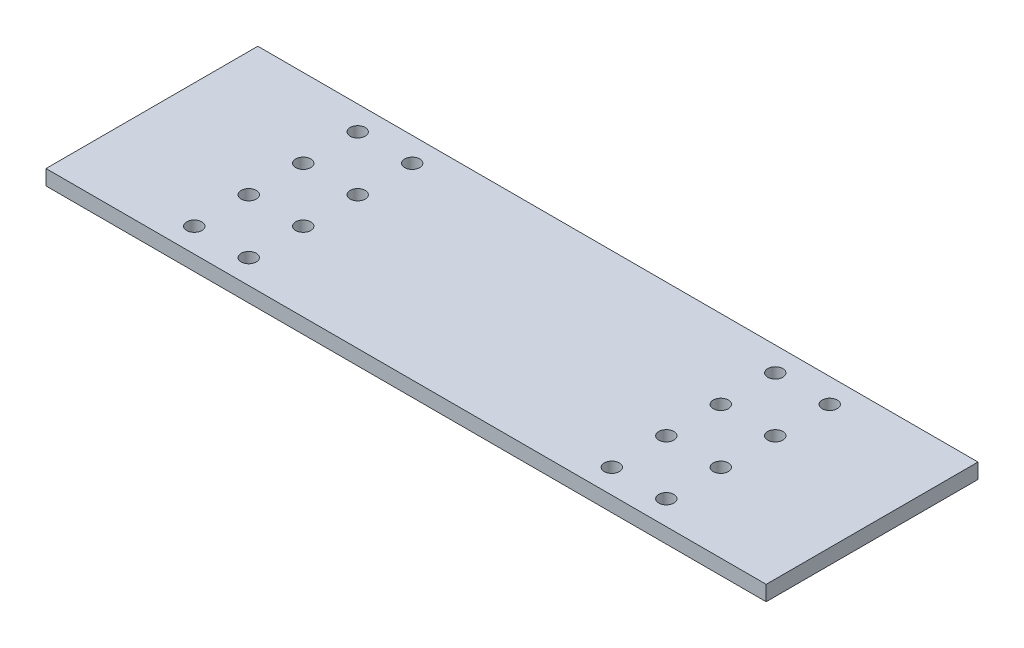
ISO-10303-21;
HEADER;
FILE_DESCRIPTION(('STEP AP214'),'2;1');
FILE_NAME('part.step','',(''),(''),'','','');
FILE_SCHEMA(('AUTOMOTIVE_DESIGN { 1 0 10303 214 1 1 1 1 }'));
ENDSEC;
DATA;
#1=APPLICATION_CONTEXT('core data for automotive mechanical design processes');
#2=APPLICATION_PROTOCOL_DEFINITION('international standard','automotive_design',2000,#1);
#3=PRODUCT_CONTEXT('',#1,'mechanical');
#4=PRODUCT('Part','Part','',(#3));
#5=PRODUCT_RELATED_PRODUCT_CATEGORY('part','',(#4));
#6=PRODUCT_DEFINITION_FORMATION('','',#4);
#7=PRODUCT_DEFINITION_CONTEXT('part definition',#1,'design');
#8=PRODUCT_DEFINITION('design','',#6,#7);
#9=PRODUCT_DEFINITION_SHAPE('','',#8);
#10=(LENGTH_UNIT() NAMED_UNIT(*) SI_UNIT(.MILLI.,.METRE.));
#11=(NAMED_UNIT(*) PLANE_ANGLE_UNIT() SI_UNIT($,.RADIAN.));
#12=(NAMED_UNIT(*) SI_UNIT($,.STERADIAN.) SOLID_ANGLE_UNIT());
#13=UNCERTAINTY_MEASURE_WITH_UNIT(LENGTH_MEASURE(1.E-05),#10,'distance_accuracy_value','');
#14=(GEOMETRIC_REPRESENTATION_CONTEXT(3) GLOBAL_UNCERTAINTY_ASSIGNED_CONTEXT((#13)) GLOBAL_UNIT_ASSIGNED_CONTEXT((#10,
#11,#12)) REPRESENTATION_CONTEXT('',''));
#15=CARTESIAN_POINT('',(0.,0.,0.));
#16=DIRECTION('',(0.,0.,1.));
#17=DIRECTION('',(1.,0.,0.));
#18=AXIS2_PLACEMENT_3D('',#15,#16,#17);
#19=CARTESIAN_POINT('',(0.,5.,0.));
#20=DIRECTION('',(0.,-1.,0.));
#21=DIRECTION('',(0.,0.,-1.));
#22=AXIS2_PLACEMENT_3D('',#19,#20,#21);
#23=PLANE('',#22);
#24=CARTESIAN_POINT('',(41.,5.,-8.00000000000001));
#25=DIRECTION('',(0.,1.,0.));
#26=DIRECTION('',(0.,0.,1.));
#27=AXIS2_PLACEMENT_3D('',#24,#25,#26);
#28=CIRCLE('',#27,2.5);
#29=CARTESIAN_POINT('',(41.,5.,-5.50000000000001));
#30=VERTEX_POINT('',#29);
#31=EDGE_CURVE('E193',#30,#30,#28,.T.);
#32=ORIENTED_EDGE('',*,*,#31,.F.);
#33=EDGE_LOOP('',(#32));
#34=FACE_BOUND('',#33,.T.);
#35=CARTESIAN_POINT('',(41.,5.,-26.));
#36=DIRECTION('',(0.,1.,0.));
#37=DIRECTION('',(0.,0.,1.));
#38=AXIS2_PLACEMENT_3D('',#35,#36,#37);
#39=CIRCLE('',#38,2.49999999999999);
#40=CARTESIAN_POINT('',(41.,5.,-23.5));
#41=VERTEX_POINT('',#40);
#42=EDGE_CURVE('E181',#41,#41,#39,.T.);
#43=ORIENTED_EDGE('',*,*,#42,.F.);
#44=EDGE_LOOP('',(#43));
#45=FACE_BOUND('',#44,.T.);
#46=CARTESIAN_POINT('',(179.,5.,-8.00000000000001));
#47=DIRECTION('',(0.,1.,0.));
#48=DIRECTION('',(0.,0.,1.));
#49=AXIS2_PLACEMENT_3D('',#46,#47,#48);
#50=CIRCLE('',#49,2.5);
#51=CARTESIAN_POINT('',(179.,5.,-5.50000000000002));
#52=VERTEX_POINT('',#51);
#53=EDGE_CURVE('E169',#52,#52,#50,.T.);
#54=ORIENTED_EDGE('',*,*,#53,.F.);
#55=EDGE_LOOP('',(#54));
#56=FACE_BOUND('',#55,.T.);
#57=CARTESIAN_POINT('',(179.,5.,-26.));
#58=DIRECTION('',(0.,1.,0.));
#59=DIRECTION('',(0.,0.,1.));
#60=AXIS2_PLACEMENT_3D('',#57,#58,#59);
#61=CIRCLE('',#60,2.5);
#62=CARTESIAN_POINT('',(179.,5.,-23.5));
#63=VERTEX_POINT('',#62);
#64=EDGE_CURVE('E157',#63,#63,#61,.T.);
#65=ORIENTED_EDGE('',*,*,#64,.F.);
#66=EDGE_LOOP('',(#65));
#67=FACE_BOUND('',#66,.T.);
#68=CARTESIAN_POINT('',(179.,5.,-44.));
#69=DIRECTION('',(0.,1.,0.));
#70=DIRECTION('',(0.,0.,1.));
#71=AXIS2_PLACEMENT_3D('',#68,#69,#70);
#72=CIRCLE('',#71,2.5);
#73=CARTESIAN_POINT('',(179.,5.,-41.5));
#74=VERTEX_POINT('',#73);
#75=EDGE_CURVE('E145',#74,#74,#72,.T.);
#76=ORIENTED_EDGE('',*,*,#75,.F.);
#77=EDGE_LOOP('',(#76));
#78=FACE_BOUND('',#77,.T.);
#79=CARTESIAN_POINT('',(179.,5.,-62.));
#80=DIRECTION('',(0.,1.,0.));
#81=DIRECTION('',(0.,0.,1.));
#82=AXIS2_PLACEMENT_3D('',#79,#80,#81);
#83=CIRCLE('',#82,2.5);
#84=CARTESIAN_POINT('',(179.,5.,-59.5));
#85=VERTEX_POINT('',#84);
#86=EDGE_CURVE('E133',#85,#85,#83,.T.);
#87=ORIENTED_EDGE('',*,*,#86,.F.);
#88=EDGE_LOOP('',(#87));
#89=FACE_BOUND('',#88,.T.);
#90=CARTESIAN_POINT('',(41.,5.,-44.));
#91=DIRECTION('',(0.,1.,0.));
#92=DIRECTION('',(0.,0.,1.));
#93=AXIS2_PLACEMENT_3D('',#90,#91,#92);
#94=CIRCLE('',#93,2.5);
#95=CARTESIAN_POINT('',(41.,5.,-41.5));
#96=VERTEX_POINT('',#95);
#97=EDGE_CURVE('E121',#96,#96,#94,.T.);
#98=ORIENTED_EDGE('',*,*,#97,.F.);
#99=EDGE_LOOP('',(#98));
#100=FACE_BOUND('',#99,.T.);
#101=CARTESIAN_POINT('',(41.,5.,-62.));
#102=DIRECTION('',(0.,1.,0.));
#103=DIRECTION('',(0.,0.,1.));
#104=AXIS2_PLACEMENT_3D('',#101,#102,#103);
#105=CIRCLE('',#104,2.49999999999999);
#106=CARTESIAN_POINT('',(41.,5.,-59.5));
#107=VERTEX_POINT('',#106);
#108=EDGE_CURVE('E100',#107,#107,#105,.T.);
#109=ORIENTED_EDGE('',*,*,#108,.F.);
#110=EDGE_LOOP('',(#109));
#111=FACE_BOUND('',#110,.T.);
#112=DIRECTION('',(0.,0.,1.));
#113=VECTOR('',#112,1.);
#114=CARTESIAN_POINT('',(0.,5.,0.));
#115=LINE('',#114,#113);
#116=CARTESIAN_POINT('',(0.,5.,-70.));
#117=VERTEX_POINT('',#116);
#118=CARTESIAN_POINT('',(0.,5.,0.));
#119=VERTEX_POINT('',#118);
#120=EDGE_CURVE('E85',#117,#119,#115,.T.);
#121=ORIENTED_EDGE('',*,*,#120,.T.);
#122=DIRECTION('',(1.,0.,0.));
#123=VECTOR('',#122,1.);
#124=CARTESIAN_POINT('',(0.,5.,0.));
#125=LINE('',#124,#123);
#126=CARTESIAN_POINT('',(238.,5.,0.));
#127=VERTEX_POINT('',#126);
#128=EDGE_CURVE('E80',#119,#127,#125,.T.);
#129=ORIENTED_EDGE('',*,*,#128,.T.);
#130=DIRECTION('',(0.,0.,-1.));
#131=VECTOR('',#130,1.);
#132=CARTESIAN_POINT('',(238.,5.,0.));
#133=LINE('',#132,#131);
#134=CARTESIAN_POINT('',(238.,5.,-70.));
#135=VERTEX_POINT('',#134);
#136=EDGE_CURVE('E83',#127,#135,#133,.T.);
#137=ORIENTED_EDGE('',*,*,#136,.T.);
#138=DIRECTION('',(-1.,0.,0.));
#139=VECTOR('',#138,1.);
#140=CARTESIAN_POINT('',(0.,5.,-70.));
#141=LINE('',#140,#139);
#142=EDGE_CURVE('E50',#135,#117,#141,.T.);
#143=ORIENTED_EDGE('',*,*,#142,.T.);
#144=EDGE_LOOP('',(#121,#129,#137,#143));
#145=FACE_BOUND('',#144,.T.);
#146=CARTESIAN_POINT('',(59.,5.,-62.0000000000003));
#147=DIRECTION('',(0.,1.,0.));
#148=DIRECTION('',(0.,0.,1.));
#149=AXIS2_PLACEMENT_3D('',#146,#147,#148);
#150=CIRCLE('',#149,2.5);
#151=CARTESIAN_POINT('',(59.,5.,-59.5000000000003));
#152=VERTEX_POINT('',#151);
#153=EDGE_CURVE('E115',#152,#152,#150,.T.);
#154=ORIENTED_EDGE('',*,*,#153,.F.);
#155=EDGE_LOOP('',(#154));
#156=FACE_BOUND('',#155,.T.);
#157=CARTESIAN_POINT('',(59.,5.,-44.));
#158=DIRECTION('',(0.,1.,0.));
#159=DIRECTION('',(0.,0.,1.));
#160=AXIS2_PLACEMENT_3D('',#157,#158,#159);
#161=CIRCLE('',#160,2.5);
#162=CARTESIAN_POINT('',(59.,5.,-41.5));
#163=VERTEX_POINT('',#162);
#164=EDGE_CURVE('E127',#163,#163,#161,.T.);
#165=ORIENTED_EDGE('',*,*,#164,.F.);
#166=EDGE_LOOP('',(#165));
#167=FACE_BOUND('',#166,.T.);
#168=CARTESIAN_POINT('',(197.,5.,-62.));
#169=DIRECTION('',(0.,1.,0.));
#170=DIRECTION('',(0.,0.,1.));
#171=AXIS2_PLACEMENT_3D('',#168,#169,#170);
#172=CIRCLE('',#171,2.5);
#173=CARTESIAN_POINT('',(197.,5.,-59.5));
#174=VERTEX_POINT('',#173);
#175=EDGE_CURVE('E139',#174,#174,#172,.T.);
#176=ORIENTED_EDGE('',*,*,#175,.F.);
#177=EDGE_LOOP('',(#176));
#178=FACE_BOUND('',#177,.T.);
#179=CARTESIAN_POINT('',(197.,5.,-44.));
#180=DIRECTION('',(0.,1.,0.));
#181=DIRECTION('',(0.,0.,1.));
#182=AXIS2_PLACEMENT_3D('',#179,#180,#181);
#183=CIRCLE('',#182,2.5);
#184=CARTESIAN_POINT('',(197.,5.,-41.5));
#185=VERTEX_POINT('',#184);
#186=EDGE_CURVE('E151',#185,#185,#183,.T.);
#187=ORIENTED_EDGE('',*,*,#186,.F.);
#188=EDGE_LOOP('',(#187));
#189=FACE_BOUND('',#188,.T.);
#190=CARTESIAN_POINT('',(197.,5.,-26.));
#191=DIRECTION('',(0.,1.,0.));
#192=DIRECTION('',(0.,0.,1.));
#193=AXIS2_PLACEMENT_3D('',#190,#191,#192);
#194=CIRCLE('',#193,2.5);
#195=CARTESIAN_POINT('',(197.,5.,-23.5));
#196=VERTEX_POINT('',#195);
#197=EDGE_CURVE('E163',#196,#196,#194,.T.);
#198=ORIENTED_EDGE('',*,*,#197,.F.);
#199=EDGE_LOOP('',(#198));
#200=FACE_BOUND('',#199,.T.);
#201=CARTESIAN_POINT('',(197.,5.,-8.00000000000001));
#202=DIRECTION('',(0.,1.,0.));
#203=DIRECTION('',(0.,0.,1.));
#204=AXIS2_PLACEMENT_3D('',#201,#202,#203);
#205=CIRCLE('',#204,2.5);
#206=CARTESIAN_POINT('',(197.,5.,-5.50000000000002));
#207=VERTEX_POINT('',#206);
#208=EDGE_CURVE('E175',#207,#207,#205,.T.);
#209=ORIENTED_EDGE('',*,*,#208,.F.);
#210=EDGE_LOOP('',(#209));
#211=FACE_BOUND('',#210,.T.);
#212=CARTESIAN_POINT('',(59.,5.,-26.));
#213=DIRECTION('',(0.,1.,0.));
#214=DIRECTION('',(0.,0.,1.));
#215=AXIS2_PLACEMENT_3D('',#212,#213,#214);
#216=CIRCLE('',#215,2.5);
#217=CARTESIAN_POINT('',(59.,5.,-23.5));
#218=VERTEX_POINT('',#217);
#219=EDGE_CURVE('E187',#218,#218,#216,.T.);
#220=ORIENTED_EDGE('',*,*,#219,.F.);
#221=EDGE_LOOP('',(#220));
#222=FACE_BOUND('',#221,.T.);
#223=CARTESIAN_POINT('',(59.,5.,-8.00000000000001));
#224=DIRECTION('',(0.,1.,0.));
#225=DIRECTION('',(0.,0.,1.));
#226=AXIS2_PLACEMENT_3D('',#223,#224,#225);
#227=CIRCLE('',#226,2.5);
#228=CARTESIAN_POINT('',(59.,5.,-5.50000000000001));
#229=VERTEX_POINT('',#228);
#230=EDGE_CURVE('E199',#229,#229,#227,.T.);
#231=ORIENTED_EDGE('',*,*,#230,.F.);
#232=EDGE_LOOP('',(#231));
#233=FACE_BOUND('',#232,.T.);
#234=ADVANCED_FACE('F33',(#34,#45,#56,#67,#78,#89,#100,#111,#145,#156,#167,#178,#189,#200,#211,
#222,#233),#23,.F.);
#235=CARTESIAN_POINT('',(0.,0.,0.));
#236=DIRECTION('',(0.,-1.,0.));
#237=DIRECTION('',(0.,0.,-1.));
#238=AXIS2_PLACEMENT_3D('',#235,#236,#237);
#239=PLANE('',#238);
#240=CARTESIAN_POINT('',(41.,0.,-8.00000000000001));
#241=DIRECTION('',(0.,1.,0.));
#242=DIRECTION('',(0.,0.,1.));
#243=AXIS2_PLACEMENT_3D('',#240,#241,#242);
#244=CIRCLE('',#243,2.5);
#245=CARTESIAN_POINT('',(41.,0.,-5.50000000000001));
#246=VERTEX_POINT('',#245);
#247=EDGE_CURVE('E196',#246,#246,#244,.T.);
#248=ORIENTED_EDGE('',*,*,#247,.T.);
#249=EDGE_LOOP('',(#248));
#250=FACE_BOUND('',#249,.T.);
#251=CARTESIAN_POINT('',(41.,0.,-26.));
#252=DIRECTION('',(0.,1.,0.));
#253=DIRECTION('',(0.,0.,1.));
#254=AXIS2_PLACEMENT_3D('',#251,#252,#253);
#255=CIRCLE('',#254,2.49999999999999);
#256=CARTESIAN_POINT('',(41.,0.,-23.5));
#257=VERTEX_POINT('',#256);
#258=EDGE_CURVE('E184',#257,#257,#255,.T.);
#259=ORIENTED_EDGE('',*,*,#258,.T.);
#260=EDGE_LOOP('',(#259));
#261=FACE_BOUND('',#260,.T.);
#262=CARTESIAN_POINT('',(179.,0.,-8.00000000000001));
#263=DIRECTION('',(0.,1.,0.));
#264=DIRECTION('',(0.,0.,1.));
#265=AXIS2_PLACEMENT_3D('',#262,#263,#264);
#266=CIRCLE('',#265,2.5);
#267=CARTESIAN_POINT('',(179.,0.,-5.50000000000002));
#268=VERTEX_POINT('',#267);
#269=EDGE_CURVE('E172',#268,#268,#266,.T.);
#270=ORIENTED_EDGE('',*,*,#269,.T.);
#271=EDGE_LOOP('',(#270));
#272=FACE_BOUND('',#271,.T.);
#273=CARTESIAN_POINT('',(179.,0.,-26.));
#274=DIRECTION('',(0.,1.,0.));
#275=DIRECTION('',(0.,0.,1.));
#276=AXIS2_PLACEMENT_3D('',#273,#274,#275);
#277=CIRCLE('',#276,2.5);
#278=CARTESIAN_POINT('',(179.,0.,-23.5));
#279=VERTEX_POINT('',#278);
#280=EDGE_CURVE('E160',#279,#279,#277,.T.);
#281=ORIENTED_EDGE('',*,*,#280,.T.);
#282=EDGE_LOOP('',(#281));
#283=FACE_BOUND('',#282,.T.);
#284=CARTESIAN_POINT('',(179.,0.,-44.));
#285=DIRECTION('',(0.,1.,0.));
#286=DIRECTION('',(0.,0.,1.));
#287=AXIS2_PLACEMENT_3D('',#284,#285,#286);
#288=CIRCLE('',#287,2.5);
#289=CARTESIAN_POINT('',(179.,0.,-41.5));
#290=VERTEX_POINT('',#289);
#291=EDGE_CURVE('E148',#290,#290,#288,.T.);
#292=ORIENTED_EDGE('',*,*,#291,.T.);
#293=EDGE_LOOP('',(#292));
#294=FACE_BOUND('',#293,.T.);
#295=CARTESIAN_POINT('',(179.,0.,-62.));
#296=DIRECTION('',(0.,1.,0.));
#297=DIRECTION('',(0.,0.,1.));
#298=AXIS2_PLACEMENT_3D('',#295,#296,#297);
#299=CIRCLE('',#298,2.5);
#300=CARTESIAN_POINT('',(179.,0.,-59.5));
#301=VERTEX_POINT('',#300);
#302=EDGE_CURVE('E136',#301,#301,#299,.T.);
#303=ORIENTED_EDGE('',*,*,#302,.T.);
#304=EDGE_LOOP('',(#303));
#305=FACE_BOUND('',#304,.T.);
#306=CARTESIAN_POINT('',(41.,0.,-44.));
#307=DIRECTION('',(0.,1.,0.));
#308=DIRECTION('',(0.,0.,1.));
#309=AXIS2_PLACEMENT_3D('',#306,#307,#308);
#310=CIRCLE('',#309,2.5);
#311=CARTESIAN_POINT('',(41.,0.,-41.5));
#312=VERTEX_POINT('',#311);
#313=EDGE_CURVE('E124',#312,#312,#310,.T.);
#314=ORIENTED_EDGE('',*,*,#313,.T.);
#315=EDGE_LOOP('',(#314));
#316=FACE_BOUND('',#315,.T.);
#317=CARTESIAN_POINT('',(41.,0.,-62.));
#318=DIRECTION('',(0.,1.,0.));
#319=DIRECTION('',(0.,0.,1.));
#320=AXIS2_PLACEMENT_3D('',#317,#318,#319);
#321=CIRCLE('',#320,2.49999999999999);
#322=CARTESIAN_POINT('',(41.,0.,-59.5));
#323=VERTEX_POINT('',#322);
#324=EDGE_CURVE('E112',#323,#323,#321,.T.);
#325=ORIENTED_EDGE('',*,*,#324,.T.);
#326=EDGE_LOOP('',(#325));
#327=FACE_BOUND('',#326,.T.);
#328=DIRECTION('',(0.,0.,1.));
#329=VECTOR('',#328,1.);
#330=CARTESIAN_POINT('',(0.,0.,0.));
#331=LINE('',#330,#329);
#332=CARTESIAN_POINT('',(0.,0.,-70.));
#333=VERTEX_POINT('',#332);
#334=CARTESIAN_POINT('',(0.,0.,0.));
#335=VERTEX_POINT('',#334);
#336=EDGE_CURVE('E97',#333,#335,#331,.T.);
#337=ORIENTED_EDGE('',*,*,#336,.F.);
#338=DIRECTION('',(-1.,0.,0.));
#339=VECTOR('',#338,1.);
#340=CARTESIAN_POINT('',(0.,0.,-70.));
#341=LINE('',#340,#339);
#342=CARTESIAN_POINT('',(238.,0.,-70.));
#343=VERTEX_POINT('',#342);
#344=EDGE_CURVE('E73',#343,#333,#341,.T.);
#345=ORIENTED_EDGE('',*,*,#344,.F.);
#346=DIRECTION('',(0.,0.,-1.));
#347=VECTOR('',#346,1.);
#348=CARTESIAN_POINT('',(238.,0.,0.));
#349=LINE('',#348,#347);
#350=CARTESIAN_POINT('',(238.,0.,0.));
#351=VERTEX_POINT('',#350);
#352=EDGE_CURVE('E67',#351,#343,#349,.T.);
#353=ORIENTED_EDGE('',*,*,#352,.F.);
#354=DIRECTION('',(1.,0.,0.));
#355=VECTOR('',#354,1.);
#356=CARTESIAN_POINT('',(0.,0.,0.));
#357=LINE('',#356,#355);
#358=EDGE_CURVE('E89',#335,#351,#357,.T.);
#359=ORIENTED_EDGE('',*,*,#358,.F.);
#360=EDGE_LOOP('',(#337,#345,#353,#359));
#361=FACE_BOUND('',#360,.T.);
#362=CARTESIAN_POINT('',(59.,0.,-62.0000000000003));
#363=DIRECTION('',(0.,1.,0.));
#364=DIRECTION('',(0.,0.,1.));
#365=AXIS2_PLACEMENT_3D('',#362,#363,#364);
#366=CIRCLE('',#365,2.5);
#367=CARTESIAN_POINT('',(59.,0.,-59.5000000000003));
#368=VERTEX_POINT('',#367);
#369=EDGE_CURVE('E118',#368,#368,#366,.T.);
#370=ORIENTED_EDGE('',*,*,#369,.T.);
#371=EDGE_LOOP('',(#370));
#372=FACE_BOUND('',#371,.T.);
#373=CARTESIAN_POINT('',(59.,0.,-44.));
#374=DIRECTION('',(0.,1.,0.));
#375=DIRECTION('',(0.,0.,1.));
#376=AXIS2_PLACEMENT_3D('',#373,#374,#375);
#377=CIRCLE('',#376,2.5);
#378=CARTESIAN_POINT('',(59.,0.,-41.5));
#379=VERTEX_POINT('',#378);
#380=EDGE_CURVE('E130',#379,#379,#377,.T.);
#381=ORIENTED_EDGE('',*,*,#380,.T.);
#382=EDGE_LOOP('',(#381));
#383=FACE_BOUND('',#382,.T.);
#384=CARTESIAN_POINT('',(197.,0.,-62.));
#385=DIRECTION('',(0.,1.,0.));
#386=DIRECTION('',(0.,0.,1.));
#387=AXIS2_PLACEMENT_3D('',#384,#385,#386);
#388=CIRCLE('',#387,2.5);
#389=CARTESIAN_POINT('',(197.,0.,-59.5));
#390=VERTEX_POINT('',#389);
#391=EDGE_CURVE('E142',#390,#390,#388,.T.);
#392=ORIENTED_EDGE('',*,*,#391,.T.);
#393=EDGE_LOOP('',(#392));
#394=FACE_BOUND('',#393,.T.);
#395=CARTESIAN_POINT('',(197.,0.,-44.));
#396=DIRECTION('',(0.,1.,0.));
#397=DIRECTION('',(0.,0.,1.));
#398=AXIS2_PLACEMENT_3D('',#395,#396,#397);
#399=CIRCLE('',#398,2.5);
#400=CARTESIAN_POINT('',(197.,0.,-41.5));
#401=VERTEX_POINT('',#400);
#402=EDGE_CURVE('E154',#401,#401,#399,.T.);
#403=ORIENTED_EDGE('',*,*,#402,.T.);
#404=EDGE_LOOP('',(#403));
#405=FACE_BOUND('',#404,.T.);
#406=CARTESIAN_POINT('',(197.,0.,-26.));
#407=DIRECTION('',(0.,1.,0.));
#408=DIRECTION('',(0.,0.,1.));
#409=AXIS2_PLACEMENT_3D('',#406,#407,#408);
#410=CIRCLE('',#409,2.5);
#411=CARTESIAN_POINT('',(197.,0.,-23.5));
#412=VERTEX_POINT('',#411);
#413=EDGE_CURVE('E166',#412,#412,#410,.T.);
#414=ORIENTED_EDGE('',*,*,#413,.T.);
#415=EDGE_LOOP('',(#414));
#416=FACE_BOUND('',#415,.T.);
#417=CARTESIAN_POINT('',(197.,0.,-8.00000000000001));
#418=DIRECTION('',(0.,1.,0.));
#419=DIRECTION('',(0.,0.,1.));
#420=AXIS2_PLACEMENT_3D('',#417,#418,#419);
#421=CIRCLE('',#420,2.5);
#422=CARTESIAN_POINT('',(197.,0.,-5.50000000000002));
#423=VERTEX_POINT('',#422);
#424=EDGE_CURVE('E178',#423,#423,#421,.T.);
#425=ORIENTED_EDGE('',*,*,#424,.T.);
#426=EDGE_LOOP('',(#425));
#427=FACE_BOUND('',#426,.T.);
#428=CARTESIAN_POINT('',(59.,0.,-26.));
#429=DIRECTION('',(0.,1.,0.));
#430=DIRECTION('',(0.,0.,1.));
#431=AXIS2_PLACEMENT_3D('',#428,#429,#430);
#432=CIRCLE('',#431,2.5);
#433=CARTESIAN_POINT('',(59.,0.,-23.5));
#434=VERTEX_POINT('',#433);
#435=EDGE_CURVE('E190',#434,#434,#432,.T.);
#436=ORIENTED_EDGE('',*,*,#435,.T.);
#437=EDGE_LOOP('',(#436));
#438=FACE_BOUND('',#437,.T.);
#439=CARTESIAN_POINT('',(59.,0.,-8.00000000000001));
#440=DIRECTION('',(0.,1.,0.));
#441=DIRECTION('',(0.,0.,1.));
#442=AXIS2_PLACEMENT_3D('',#439,#440,#441);
#443=CIRCLE('',#442,2.5);
#444=CARTESIAN_POINT('',(59.,0.,-5.50000000000001));
#445=VERTEX_POINT('',#444);
#446=EDGE_CURVE('E202',#445,#445,#443,.T.);
#447=ORIENTED_EDGE('',*,*,#446,.T.);
#448=EDGE_LOOP('',(#447));
#449=FACE_BOUND('',#448,.T.);
#450=ADVANCED_FACE('F108',(#250,#261,#272,#283,#294,#305,#316,#327,#361,#372,#383,#394,#405,
#416,#427,#438,#449),#239,.T.);
#451=CARTESIAN_POINT('',(0.,5.,0.));
#452=DIRECTION('',(1.,0.,0.));
#453=DIRECTION('',(0.,0.,-1.));
#454=AXIS2_PLACEMENT_3D('',#451,#452,#453);
#455=PLANE('',#454);
#456=ORIENTED_EDGE('',*,*,#336,.T.);
#457=DIRECTION('',(0.,-1.,0.));
#458=VECTOR('',#457,1.);
#459=CARTESIAN_POINT('',(0.,5.,0.));
#460=LINE('',#459,#458);
#461=EDGE_CURVE('E11',#119,#335,#460,.T.);
#462=ORIENTED_EDGE('',*,*,#461,.F.);
#463=ORIENTED_EDGE('',*,*,#120,.F.);
#464=DIRECTION('',(0.,-1.,0.));
#465=VECTOR('',#464,1.);
#466=CARTESIAN_POINT('',(0.,5.,-70.));
#467=LINE('',#466,#465);
#468=EDGE_CURVE('E93',#117,#333,#467,.T.);
#469=ORIENTED_EDGE('',*,*,#468,.T.);
#470=EDGE_LOOP('',(#456,#462,#463,#469));
#471=FACE_BOUND('',#470,.T.);
#472=ADVANCED_FACE('F35',(#471),#455,.F.);
#473=CARTESIAN_POINT('',(0.,5.,0.));
#474=DIRECTION('',(0.,0.,-1.));
#475=DIRECTION('',(-1.,0.,0.));
#476=AXIS2_PLACEMENT_3D('',#473,#474,#475);
#477=PLANE('',#476);
#478=ORIENTED_EDGE('',*,*,#358,.T.);
#479=DIRECTION('',(0.,-1.,0.));
#480=VECTOR('',#479,1.);
#481=CARTESIAN_POINT('',(238.,5.,0.));
#482=LINE('',#481,#480);
#483=EDGE_CURVE('E42',#127,#351,#482,.T.);
#484=ORIENTED_EDGE('',*,*,#483,.F.);
#485=ORIENTED_EDGE('',*,*,#128,.F.);
#486=ORIENTED_EDGE('',*,*,#461,.T.);
#487=EDGE_LOOP('',(#478,#484,#485,#486));
#488=FACE_BOUND('',#487,.T.);
#489=ADVANCED_FACE('F88',(#488),#477,.F.);
#490=CARTESIAN_POINT('',(238.,5.,0.));
#491=DIRECTION('',(-1.,0.,0.));
#492=DIRECTION('',(0.,0.,1.));
#493=AXIS2_PLACEMENT_3D('',#490,#491,#492);
#494=PLANE('',#493);
#495=ORIENTED_EDGE('',*,*,#352,.T.);
#496=DIRECTION('',(0.,-1.,0.));
#497=VECTOR('',#496,1.);
#498=CARTESIAN_POINT('',(238.,5.,-70.));
#499=LINE('',#498,#497);
#500=EDGE_CURVE('E90',#135,#343,#499,.T.);
#501=ORIENTED_EDGE('',*,*,#500,.F.);
#502=ORIENTED_EDGE('',*,*,#136,.F.);
#503=ORIENTED_EDGE('',*,*,#483,.T.);
#504=EDGE_LOOP('',(#495,#501,#502,#503));
#505=FACE_BOUND('',#504,.T.);
#506=ADVANCED_FACE('F91',(#505),#494,.F.);
#507=CARTESIAN_POINT('',(0.,5.,-70.));
#508=DIRECTION('',(0.,0.,1.));
#509=DIRECTION('',(1.,0.,0.));
#510=AXIS2_PLACEMENT_3D('',#507,#508,#509);
#511=PLANE('',#510);
#512=ORIENTED_EDGE('',*,*,#344,.T.);
#513=ORIENTED_EDGE('',*,*,#468,.F.);
#514=ORIENTED_EDGE('',*,*,#142,.F.);
#515=ORIENTED_EDGE('',*,*,#500,.T.);
#516=EDGE_LOOP('',(#512,#513,#514,#515));
#517=FACE_BOUND('',#516,.T.);
#518=ADVANCED_FACE('F105',(#517),#511,.F.);
#519=CARTESIAN_POINT('',(41.,5.,-62.));
#520=DIRECTION('',(0.,-1.,0.));
#521=DIRECTION('',(0.,0.,-1.));
#522=AXIS2_PLACEMENT_3D('',#519,#520,#521);
#523=CYLINDRICAL_SURFACE('',#522,2.49999999999999);
#524=ORIENTED_EDGE('',*,*,#108,.T.);
#525=EDGE_LOOP('',(#524));
#526=FACE_BOUND('',#525,.T.);
#527=ORIENTED_EDGE('',*,*,#324,.F.);
#528=EDGE_LOOP('',(#527));
#529=FACE_BOUND('',#528,.T.);
#530=ADVANCED_FACE('F222',(#526,#529),#523,.F.);
#531=CARTESIAN_POINT('',(59.,5.,-62.0000000000003));
#532=DIRECTION('',(0.,-1.,0.));
#533=DIRECTION('',(0.,0.,-1.));
#534=AXIS2_PLACEMENT_3D('',#531,#532,#533);
#535=CYLINDRICAL_SURFACE('',#534,2.5);
#536=ORIENTED_EDGE('',*,*,#153,.T.);
#537=EDGE_LOOP('',(#536));
#538=FACE_BOUND('',#537,.T.);
#539=ORIENTED_EDGE('',*,*,#369,.F.);
#540=EDGE_LOOP('',(#539));
#541=FACE_BOUND('',#540,.T.);
#542=ADVANCED_FACE('F268',(#538,#541),#535,.F.);
#543=CARTESIAN_POINT('',(41.,5.,-44.));
#544=DIRECTION('',(0.,-1.,0.));
#545=DIRECTION('',(0.,0.,-1.));
#546=AXIS2_PLACEMENT_3D('',#543,#544,#545);
#547=CYLINDRICAL_SURFACE('',#546,2.5);
#548=ORIENTED_EDGE('',*,*,#97,.T.);
#549=EDGE_LOOP('',(#548));
#550=FACE_BOUND('',#549,.T.);
#551=ORIENTED_EDGE('',*,*,#313,.F.);
#552=EDGE_LOOP('',(#551));
#553=FACE_BOUND('',#552,.T.);
#554=ADVANCED_FACE('F276',(#550,#553),#547,.F.);
#555=CARTESIAN_POINT('',(59.,5.,-44.));
#556=DIRECTION('',(0.,-1.,0.));
#557=DIRECTION('',(0.,0.,-1.));
#558=AXIS2_PLACEMENT_3D('',#555,#556,#557);
#559=CYLINDRICAL_SURFACE('',#558,2.5);
#560=ORIENTED_EDGE('',*,*,#164,.T.);
#561=EDGE_LOOP('',(#560));
#562=FACE_BOUND('',#561,.T.);
#563=ORIENTED_EDGE('',*,*,#380,.F.);
#564=EDGE_LOOP('',(#563));
#565=FACE_BOUND('',#564,.T.);
#566=ADVANCED_FACE('F284',(#562,#565),#559,.F.);
#567=CARTESIAN_POINT('',(179.,5.,-62.));
#568=DIRECTION('',(0.,-1.,0.));
#569=DIRECTION('',(0.,0.,-1.));
#570=AXIS2_PLACEMENT_3D('',#567,#568,#569);
#571=CYLINDRICAL_SURFACE('',#570,2.5);
#572=ORIENTED_EDGE('',*,*,#86,.T.);
#573=EDGE_LOOP('',(#572));
#574=FACE_BOUND('',#573,.T.);
#575=ORIENTED_EDGE('',*,*,#302,.F.);
#576=EDGE_LOOP('',(#575));
#577=FACE_BOUND('',#576,.T.);
#578=ADVANCED_FACE('F293',(#574,#577),#571,.F.);
#579=CARTESIAN_POINT('',(197.,5.,-62.));
#580=DIRECTION('',(0.,-1.,0.));
#581=DIRECTION('',(0.,0.,-1.));
#582=AXIS2_PLACEMENT_3D('',#579,#580,#581);
#583=CYLINDRICAL_SURFACE('',#582,2.5);
#584=ORIENTED_EDGE('',*,*,#175,.T.);
#585=EDGE_LOOP('',(#584));
#586=FACE_BOUND('',#585,.T.);
#587=ORIENTED_EDGE('',*,*,#391,.F.);
#588=EDGE_LOOP('',(#587));
#589=FACE_BOUND('',#588,.T.);
#590=ADVANCED_FACE('F302',(#586,#589),#583,.F.);
#591=CARTESIAN_POINT('',(179.,5.,-44.));
#592=DIRECTION('',(0.,-1.,0.));
#593=DIRECTION('',(0.,0.,-1.));
#594=AXIS2_PLACEMENT_3D('',#591,#592,#593);
#595=CYLINDRICAL_SURFACE('',#594,2.5);
#596=ORIENTED_EDGE('',*,*,#75,.T.);
#597=EDGE_LOOP('',(#596));
#598=FACE_BOUND('',#597,.T.);
#599=ORIENTED_EDGE('',*,*,#291,.F.);
#600=EDGE_LOOP('',(#599));
#601=FACE_BOUND('',#600,.T.);
#602=ADVANCED_FACE('F311',(#598,#601),#595,.F.);
#603=CARTESIAN_POINT('',(197.,5.,-44.));
#604=DIRECTION('',(0.,-1.,0.));
#605=DIRECTION('',(0.,0.,-1.));
#606=AXIS2_PLACEMENT_3D('',#603,#604,#605);
#607=CYLINDRICAL_SURFACE('',#606,2.5);
#608=ORIENTED_EDGE('',*,*,#186,.T.);
#609=EDGE_LOOP('',(#608));
#610=FACE_BOUND('',#609,.T.);
#611=ORIENTED_EDGE('',*,*,#402,.F.);
#612=EDGE_LOOP('',(#611));
#613=FACE_BOUND('',#612,.T.);
#614=ADVANCED_FACE('F320',(#610,#613),#607,.F.);
#615=CARTESIAN_POINT('',(179.,5.,-26.));
#616=DIRECTION('',(0.,-1.,0.));
#617=DIRECTION('',(0.,0.,-1.));
#618=AXIS2_PLACEMENT_3D('',#615,#616,#617);
#619=CYLINDRICAL_SURFACE('',#618,2.5);
#620=ORIENTED_EDGE('',*,*,#64,.T.);
#621=EDGE_LOOP('',(#620));
#622=FACE_BOUND('',#621,.T.);
#623=ORIENTED_EDGE('',*,*,#280,.F.);
#624=EDGE_LOOP('',(#623));
#625=FACE_BOUND('',#624,.T.);
#626=ADVANCED_FACE('F329',(#622,#625),#619,.F.);
#627=CARTESIAN_POINT('',(197.,5.,-26.));
#628=DIRECTION('',(0.,-1.,0.));
#629=DIRECTION('',(0.,0.,-1.));
#630=AXIS2_PLACEMENT_3D('',#627,#628,#629);
#631=CYLINDRICAL_SURFACE('',#630,2.5);
#632=ORIENTED_EDGE('',*,*,#197,.T.);
#633=EDGE_LOOP('',(#632));
#634=FACE_BOUND('',#633,.T.);
#635=ORIENTED_EDGE('',*,*,#413,.F.);
#636=EDGE_LOOP('',(#635));
#637=FACE_BOUND('',#636,.T.);
#638=ADVANCED_FACE('F338',(#634,#637),#631,.F.);
#639=CARTESIAN_POINT('',(179.,5.,-8.00000000000001));
#640=DIRECTION('',(0.,-1.,0.));
#641=DIRECTION('',(0.,0.,-1.));
#642=AXIS2_PLACEMENT_3D('',#639,#640,#641);
#643=CYLINDRICAL_SURFACE('',#642,2.5);
#644=ORIENTED_EDGE('',*,*,#53,.T.);
#645=EDGE_LOOP('',(#644));
#646=FACE_BOUND('',#645,.T.);
#647=ORIENTED_EDGE('',*,*,#269,.F.);
#648=EDGE_LOOP('',(#647));
#649=FACE_BOUND('',#648,.T.);
#650=ADVANCED_FACE('F347',(#646,#649),#643,.F.);
#651=CARTESIAN_POINT('',(197.,5.,-8.00000000000001));
#652=DIRECTION('',(0.,-1.,0.));
#653=DIRECTION('',(0.,0.,-1.));
#654=AXIS2_PLACEMENT_3D('',#651,#652,#653);
#655=CYLINDRICAL_SURFACE('',#654,2.5);
#656=ORIENTED_EDGE('',*,*,#208,.T.);
#657=EDGE_LOOP('',(#656));
#658=FACE_BOUND('',#657,.T.);
#659=ORIENTED_EDGE('',*,*,#424,.F.);
#660=EDGE_LOOP('',(#659));
#661=FACE_BOUND('',#660,.T.);
#662=ADVANCED_FACE('F356',(#658,#661),#655,.F.);
#663=CARTESIAN_POINT('',(41.,5.,-26.));
#664=DIRECTION('',(0.,-1.,0.));
#665=DIRECTION('',(0.,0.,-1.));
#666=AXIS2_PLACEMENT_3D('',#663,#664,#665);
#667=CYLINDRICAL_SURFACE('',#666,2.49999999999999);
#668=ORIENTED_EDGE('',*,*,#42,.T.);
#669=EDGE_LOOP('',(#668));
#670=FACE_BOUND('',#669,.T.);
#671=ORIENTED_EDGE('',*,*,#258,.F.);
#672=EDGE_LOOP('',(#671));
#673=FACE_BOUND('',#672,.T.);
#674=ADVANCED_FACE('F365',(#670,#673),#667,.F.);
#675=CARTESIAN_POINT('',(59.,5.,-26.));
#676=DIRECTION('',(0.,-1.,0.));
#677=DIRECTION('',(0.,0.,-1.));
#678=AXIS2_PLACEMENT_3D('',#675,#676,#677);
#679=CYLINDRICAL_SURFACE('',#678,2.5);
#680=ORIENTED_EDGE('',*,*,#219,.T.);
#681=EDGE_LOOP('',(#680));
#682=FACE_BOUND('',#681,.T.);
#683=ORIENTED_EDGE('',*,*,#435,.F.);
#684=EDGE_LOOP('',(#683));
#685=FACE_BOUND('',#684,.T.);
#686=ADVANCED_FACE('F374',(#682,#685),#679,.F.);
#687=CARTESIAN_POINT('',(41.,5.,-8.00000000000001));
#688=DIRECTION('',(0.,-1.,0.));
#689=DIRECTION('',(0.,0.,-1.));
#690=AXIS2_PLACEMENT_3D('',#687,#688,#689);
#691=CYLINDRICAL_SURFACE('',#690,2.5);
#692=ORIENTED_EDGE('',*,*,#31,.T.);
#693=EDGE_LOOP('',(#692));
#694=FACE_BOUND('',#693,.T.);
#695=ORIENTED_EDGE('',*,*,#247,.F.);
#696=EDGE_LOOP('',(#695));
#697=FACE_BOUND('',#696,.T.);
#698=ADVANCED_FACE('F383',(#694,#697),#691,.F.);
#699=CARTESIAN_POINT('',(59.,5.,-8.00000000000001));
#700=DIRECTION('',(0.,-1.,0.));
#701=DIRECTION('',(0.,0.,-1.));
#702=AXIS2_PLACEMENT_3D('',#699,#700,#701);
#703=CYLINDRICAL_SURFACE('',#702,2.5);
#704=ORIENTED_EDGE('',*,*,#230,.T.);
#705=EDGE_LOOP('',(#704));
#706=FACE_BOUND('',#705,.T.);
#707=ORIENTED_EDGE('',*,*,#446,.F.);
#708=EDGE_LOOP('',(#707));
#709=FACE_BOUND('',#708,.T.);
#710=ADVANCED_FACE('F208',(#706,#709),#703,.F.);
#711=CLOSED_SHELL('',(#234,#450,#472,#489,#506,#518,#530,#542,#554,#566,#578,#590,#602,#614,
#626,#638,#650,#662,#674,#686,#698,#710));
#712=MANIFOLD_SOLID_BREP('B2',#711);
#713=ADVANCED_BREP_SHAPE_REPRESENTATION('',(#18,#712),#14);
#714=SHAPE_DEFINITION_REPRESENTATION(#9,#713);
ENDSEC;
END-ISO-10303-21;
